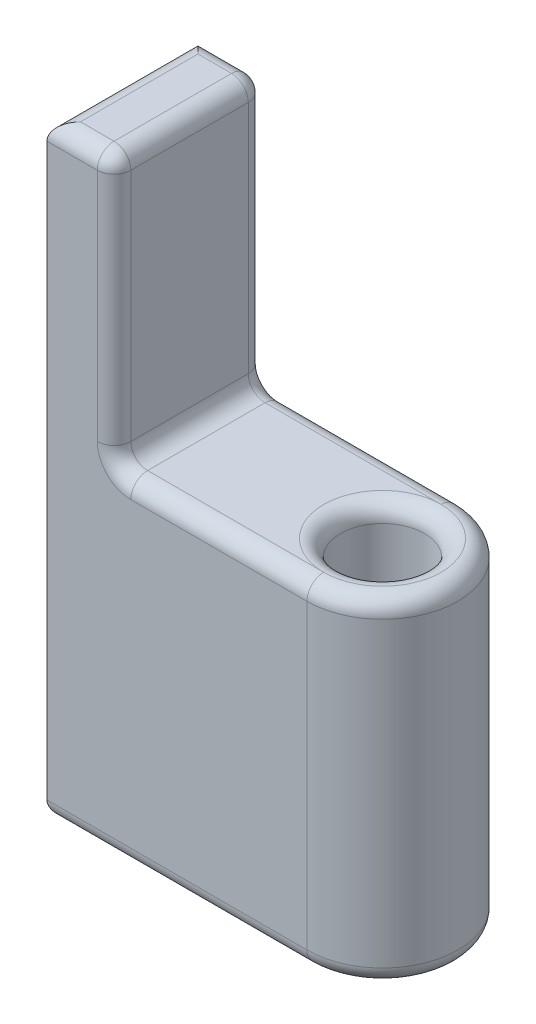
ISO-10303-21;
HEADER;
FILE_DESCRIPTION(('STEP AP214'),'2;1');
FILE_NAME('part.step','',(''),(''),'','','');
FILE_SCHEMA(('AUTOMOTIVE_DESIGN { 1 0 10303 214 1 1 1 1 }'));
ENDSEC;
DATA;
#1=APPLICATION_CONTEXT('core data for automotive mechanical design processes');
#2=APPLICATION_PROTOCOL_DEFINITION('international standard','automotive_design',2000,#1);
#3=PRODUCT_CONTEXT('',#1,'mechanical');
#4=PRODUCT('Part','Part','',(#3));
#5=PRODUCT_RELATED_PRODUCT_CATEGORY('part','',(#4));
#6=PRODUCT_DEFINITION_FORMATION('','',#4);
#7=PRODUCT_DEFINITION_CONTEXT('part definition',#1,'design');
#8=PRODUCT_DEFINITION('design','',#6,#7);
#9=PRODUCT_DEFINITION_SHAPE('','',#8);
#10=(LENGTH_UNIT() NAMED_UNIT(*) SI_UNIT(.MILLI.,.METRE.));
#11=(NAMED_UNIT(*) PLANE_ANGLE_UNIT() SI_UNIT($,.RADIAN.));
#12=(NAMED_UNIT(*) SI_UNIT($,.STERADIAN.) SOLID_ANGLE_UNIT());
#13=UNCERTAINTY_MEASURE_WITH_UNIT(LENGTH_MEASURE(1.E-05),#10,'distance_accuracy_value','');
#14=(GEOMETRIC_REPRESENTATION_CONTEXT(3) GLOBAL_UNCERTAINTY_ASSIGNED_CONTEXT((#13)) GLOBAL_UNIT_ASSIGNED_CONTEXT((#10,
#11,#12)) REPRESENTATION_CONTEXT('',''));
#15=CARTESIAN_POINT('',(0.,0.,0.));
#16=DIRECTION('',(0.,0.,1.));
#17=DIRECTION('',(1.,0.,0.));
#18=AXIS2_PLACEMENT_3D('',#15,#16,#17);
#19=CARTESIAN_POINT('',(15.5,20.,-4.5));
#20=DIRECTION('',(0.,1.,0.));
#21=DIRECTION('',(0.,0.,1.));
#22=AXIS2_PLACEMENT_3D('',#19,#20,#21);
#23=PLANE('',#22);
#24=DIRECTION('',(1.,0.,0.));
#25=VECTOR('',#24,1.);
#26=CARTESIAN_POINT('',(15.5,20.,-1.));
#27=LINE('',#26,#25);
#28=CARTESIAN_POINT('',(5.,20.,-1.));
#29=VERTEX_POINT('',#28);
#30=CARTESIAN_POINT('',(15.5,20.,-1.));
#31=VERTEX_POINT('',#30);
#32=EDGE_CURVE('E62',#29,#31,#27,.T.);
#33=ORIENTED_EDGE('',*,*,#32,.T.);
#34=CARTESIAN_POINT('',(15.5,20.,-4.5));
#35=DIRECTION('',(0.,1.,0.));
#36=DIRECTION('',(0.,0.,1.));
#37=AXIS2_PLACEMENT_3D('',#34,#35,#36);
#38=CIRCLE('',#37,3.5);
#39=CARTESIAN_POINT('',(15.5,20.,-8.));
#40=VERTEX_POINT('',#39);
#41=EDGE_CURVE('E11',#31,#40,#38,.F.);
#42=ORIENTED_EDGE('',*,*,#41,.T.);
#43=DIRECTION('',(-1.,0.,0.));
#44=VECTOR('',#43,1.);
#45=CARTESIAN_POINT('',(4.,20.,-8.));
#46=LINE('',#45,#44);
#47=CARTESIAN_POINT('',(5.,20.,-8.));
#48=VERTEX_POINT('',#47);
#49=EDGE_CURVE('E48',#40,#48,#46,.T.);
#50=ORIENTED_EDGE('',*,*,#49,.T.);
#51=DIRECTION('',(0.,0.,-1.));
#52=VECTOR('',#51,1.);
#53=CARTESIAN_POINT('',(5.,20.,-4.5));
#54=LINE('',#53,#52);
#55=EDGE_CURVE('E271',#48,#29,#54,.F.);
#56=ORIENTED_EDGE('',*,*,#55,.T.);
#57=EDGE_LOOP('',(#33,#42,#50,#56));
#58=FACE_BOUND('',#57,.T.);
#59=ADVANCED_FACE('F38',(#58),#23,.T.);
#60=CARTESIAN_POINT('',(15.5,0.,-4.5));
#61=DIRECTION('',(0.,1.,0.));
#62=DIRECTION('',(0.,0.,1.));
#63=AXIS2_PLACEMENT_3D('',#60,#61,#62);
#64=PLANE('',#63);
#65=DIRECTION('',(-1.,0.,0.));
#66=VECTOR('',#65,1.);
#67=CARTESIAN_POINT('',(15.5,0.,-8.));
#68=LINE('',#67,#66);
#69=CARTESIAN_POINT('',(1.,0.,-8.));
#70=VERTEX_POINT('',#69);
#71=CARTESIAN_POINT('',(15.5,0.,-8.));
#72=VERTEX_POINT('',#71);
#73=EDGE_CURVE('E235',#70,#72,#68,.F.);
#74=ORIENTED_EDGE('',*,*,#73,.T.);
#75=CARTESIAN_POINT('',(15.5,0.,-4.5));
#76=DIRECTION('',(0.,1.,0.));
#77=DIRECTION('',(0.,0.,1.));
#78=AXIS2_PLACEMENT_3D('',#75,#76,#77);
#79=CIRCLE('',#78,3.5);
#80=CARTESIAN_POINT('',(15.5,0.,-1.));
#81=VERTEX_POINT('',#80);
#82=EDGE_CURVE('E241',#72,#81,#79,.T.);
#83=ORIENTED_EDGE('',*,*,#82,.T.);
#84=DIRECTION('',(1.,0.,0.));
#85=VECTOR('',#84,1.);
#86=CARTESIAN_POINT('',(15.5,0.,-1.));
#87=LINE('',#86,#85);
#88=CARTESIAN_POINT('',(1.,0.,-1.));
#89=VERTEX_POINT('',#88);
#90=EDGE_CURVE('E238',#81,#89,#87,.F.);
#91=ORIENTED_EDGE('',*,*,#90,.T.);
#92=DIRECTION('',(0.,0.,1.));
#93=VECTOR('',#92,1.);
#94=CARTESIAN_POINT('',(0.999999999999999,0.,-4.5));
#95=LINE('',#94,#93);
#96=EDGE_CURVE('E232',#89,#70,#95,.F.);
#97=ORIENTED_EDGE('',*,*,#96,.T.);
#98=EDGE_LOOP('',(#74,#83,#91,#97));
#99=FACE_BOUND('',#98,.T.);
#100=ADVANCED_FACE('F360',(#99),#64,.F.);
#101=CARTESIAN_POINT('',(0.,20.,0.));
#102=DIRECTION('',(1.,0.,0.));
#103=DIRECTION('',(0.,0.,-1.));
#104=AXIS2_PLACEMENT_3D('',#101,#102,#103);
#105=PLANE('',#104);
#106=DIRECTION('',(0.,-1.,0.));
#107=VECTOR('',#106,1.);
#108=CARTESIAN_POINT('',(0.,20.,-9.));
#109=LINE('',#108,#107);
#110=CARTESIAN_POINT('',(0.,35.,-9.));
#111=VERTEX_POINT('',#110);
#112=CARTESIAN_POINT('',(0.,1.,-9.));
#113=VERTEX_POINT('',#112);
#114=EDGE_CURVE('E152',#111,#113,#109,.T.);
#115=ORIENTED_EDGE('',*,*,#114,.T.);
#116=DIRECTION('',(0.,0.,1.));
#117=VECTOR('',#116,1.);
#118=CARTESIAN_POINT('',(0.,1.,0.));
#119=LINE('',#118,#117);
#120=CARTESIAN_POINT('',(0.,1.,0.));
#121=VERTEX_POINT('',#120);
#122=EDGE_CURVE('E161',#113,#121,#119,.T.);
#123=ORIENTED_EDGE('',*,*,#122,.T.);
#124=DIRECTION('',(0.,-1.,0.));
#125=VECTOR('',#124,1.);
#126=CARTESIAN_POINT('',(0.,20.,0.));
#127=LINE('',#126,#125);
#128=CARTESIAN_POINT('',(0.,35.,0.));
#129=VERTEX_POINT('',#128);
#130=EDGE_CURVE('E155',#129,#121,#127,.T.);
#131=ORIENTED_EDGE('',*,*,#130,.F.);
#132=DIRECTION('',(0.,0.,1.));
#133=VECTOR('',#132,1.);
#134=CARTESIAN_POINT('',(0.,35.,-9.));
#135=LINE('',#134,#133);
#136=EDGE_CURVE('E149',#129,#111,#135,.F.);
#137=ORIENTED_EDGE('',*,*,#136,.T.);
#138=EDGE_LOOP('',(#115,#123,#131,#137));
#139=FACE_BOUND('',#138,.T.);
#140=ADVANCED_FACE('F151',(#139),#105,.F.);
#141=CARTESIAN_POINT('',(0.,20.,0.));
#142=DIRECTION('',(0.,0.,-1.));
#143=DIRECTION('',(-1.,0.,0.));
#144=AXIS2_PLACEMENT_3D('',#141,#142,#143);
#145=PLANE('',#144);
#146=ORIENTED_EDGE('',*,*,#130,.T.);
#147=DIRECTION('',(1.,0.,0.));
#148=VECTOR('',#147,1.);
#149=CARTESIAN_POINT('',(0.,1.,0.));
#150=LINE('',#149,#148);
#151=CARTESIAN_POINT('',(15.5,1.,0.));
#152=VERTEX_POINT('',#151);
#153=EDGE_CURVE('E228',#121,#152,#150,.T.);
#154=ORIENTED_EDGE('',*,*,#153,.T.);
#155=DIRECTION('',(0.,-1.,0.));
#156=VECTOR('',#155,1.);
#157=CARTESIAN_POINT('',(15.5,20.,0.));
#158=LINE('',#157,#156);
#159=CARTESIAN_POINT('',(15.5,19.,0.));
#160=VERTEX_POINT('',#159);
#161=EDGE_CURVE('E372',#160,#152,#158,.T.);
#162=ORIENTED_EDGE('',*,*,#161,.F.);
#163=DIRECTION('',(1.,0.,0.));
#164=VECTOR('',#163,1.);
#165=CARTESIAN_POINT('',(4.,19.,0.));
#166=LINE('',#165,#164);
#167=CARTESIAN_POINT('',(5.,19.,0.));
#168=VERTEX_POINT('',#167);
#169=EDGE_CURVE('E219',#160,#168,#166,.F.);
#170=ORIENTED_EDGE('',*,*,#169,.T.);
#171=CARTESIAN_POINT('',(5.,21.,0.));
#172=DIRECTION('',(0.,0.,-1.));
#173=DIRECTION('',(-1.,0.,0.));
#174=AXIS2_PLACEMENT_3D('',#171,#172,#173);
#175=CIRCLE('',#174,2.);
#176=CARTESIAN_POINT('',(3.,21.,0.));
#177=VERTEX_POINT('',#176);
#178=EDGE_CURVE('E215',#177,#168,#175,.F.);
#179=ORIENTED_EDGE('',*,*,#178,.F.);
#180=DIRECTION('',(0.,-1.,0.));
#181=VECTOR('',#180,1.);
#182=CARTESIAN_POINT('',(3.,20.,0.));
#183=LINE('',#182,#181);
#184=CARTESIAN_POINT('',(3.,35.,0.));
#185=VERTEX_POINT('',#184);
#186=EDGE_CURVE('E222',#177,#185,#183,.F.);
#187=ORIENTED_EDGE('',*,*,#186,.T.);
#188=DIRECTION('',(1.,0.,0.));
#189=VECTOR('',#188,1.);
#190=CARTESIAN_POINT('',(0.,35.,0.));
#191=LINE('',#190,#189);
#192=EDGE_CURVE('E225',#185,#129,#191,.F.);
#193=ORIENTED_EDGE('',*,*,#192,.T.);
#194=EDGE_LOOP('',(#146,#154,#162,#170,#179,#187,#193));
#195=FACE_BOUND('',#194,.T.);
#196=ADVANCED_FACE('F371',(#195),#145,.F.);
#197=CARTESIAN_POINT('',(15.5,20.,-4.5));
#198=DIRECTION('',(0.,-1.,0.));
#199=DIRECTION('',(0.,0.,-1.));
#200=AXIS2_PLACEMENT_3D('',#197,#198,#199);
#201=CYLINDRICAL_SURFACE('',#200,4.5);
#202=ORIENTED_EDGE('',*,*,#161,.T.);
#203=CARTESIAN_POINT('',(15.5,1.,-4.5));
#204=DIRECTION('',(0.,1.,0.));
#205=DIRECTION('',(0.,0.,1.));
#206=AXIS2_PLACEMENT_3D('',#203,#204,#205);
#207=CIRCLE('',#206,4.5);
#208=CARTESIAN_POINT('',(15.5,1.,-9.));
#209=VERTEX_POINT('',#208);
#210=EDGE_CURVE('E162',#152,#209,#207,.T.);
#211=ORIENTED_EDGE('',*,*,#210,.T.);
#212=DIRECTION('',(0.,-1.,0.));
#213=VECTOR('',#212,1.);
#214=CARTESIAN_POINT('',(15.5,20.,-9.));
#215=LINE('',#214,#213);
#216=CARTESIAN_POINT('',(15.5,19.,-9.));
#217=VERTEX_POINT('',#216);
#218=EDGE_CURVE('E174',#217,#209,#215,.T.);
#219=ORIENTED_EDGE('',*,*,#218,.F.);
#220=CARTESIAN_POINT('',(15.5,19.,-4.5));
#221=DIRECTION('',(0.,1.,0.));
#222=DIRECTION('',(0.,0.,1.));
#223=AXIS2_PLACEMENT_3D('',#220,#221,#222);
#224=CIRCLE('',#223,4.5);
#225=EDGE_CURVE('E253',#217,#160,#224,.F.);
#226=ORIENTED_EDGE('',*,*,#225,.T.);
#227=EDGE_LOOP('',(#202,#211,#219,#226));
#228=FACE_BOUND('',#227,.T.);
#229=ADVANCED_FACE('F375',(#228),#201,.T.);
#230=CARTESIAN_POINT('',(0.,20.,-9.));
#231=DIRECTION('',(0.,0.,1.));
#232=DIRECTION('',(1.,0.,0.));
#233=AXIS2_PLACEMENT_3D('',#230,#231,#232);
#234=PLANE('',#233);
#235=ORIENTED_EDGE('',*,*,#218,.T.);
#236=DIRECTION('',(-1.,0.,0.));
#237=VECTOR('',#236,1.);
#238=CARTESIAN_POINT('',(0.,1.,-9.));
#239=LINE('',#238,#237);
#240=EDGE_CURVE('E172',#209,#113,#239,.T.);
#241=ORIENTED_EDGE('',*,*,#240,.T.);
#242=ORIENTED_EDGE('',*,*,#114,.F.);
#243=DIRECTION('',(-1.,0.,0.));
#244=VECTOR('',#243,1.);
#245=CARTESIAN_POINT('',(4.,35.,-9.));
#246=LINE('',#245,#244);
#247=CARTESIAN_POINT('',(3.,35.,-9.));
#248=VERTEX_POINT('',#247);
#249=EDGE_CURVE('E169',#111,#248,#246,.F.);
#250=ORIENTED_EDGE('',*,*,#249,.T.);
#251=DIRECTION('',(0.,-1.,0.));
#252=VECTOR('',#251,1.);
#253=CARTESIAN_POINT('',(3.,20.,-9.));
#254=LINE('',#253,#252);
#255=CARTESIAN_POINT('',(3.,21.,-9.));
#256=VERTEX_POINT('',#255);
#257=EDGE_CURVE('E193',#248,#256,#254,.T.);
#258=ORIENTED_EDGE('',*,*,#257,.T.);
#259=CARTESIAN_POINT('',(5.,21.,-9.));
#260=DIRECTION('',(0.,0.,1.));
#261=DIRECTION('',(1.,0.,0.));
#262=AXIS2_PLACEMENT_3D('',#259,#260,#261);
#263=CIRCLE('',#262,2.);
#264=CARTESIAN_POINT('',(5.,19.,-9.));
#265=VERTEX_POINT('',#264);
#266=EDGE_CURVE('E199',#265,#256,#263,.F.);
#267=ORIENTED_EDGE('',*,*,#266,.F.);
#268=DIRECTION('',(-1.,0.,0.));
#269=VECTOR('',#268,1.);
#270=CARTESIAN_POINT('',(15.5,19.,-9.));
#271=LINE('',#270,#269);
#272=EDGE_CURVE('E382',#265,#217,#271,.F.);
#273=ORIENTED_EDGE('',*,*,#272,.T.);
#274=EDGE_LOOP('',(#235,#241,#242,#250,#258,#267,#273));
#275=FACE_BOUND('',#274,.T.);
#276=ADVANCED_FACE('F166',(#275),#234,.F.);
#277=CARTESIAN_POINT('',(15.5,20.,-4.5));
#278=DIRECTION('',(0.,-1.,0.));
#279=DIRECTION('',(0.,0.,-1.));
#280=AXIS2_PLACEMENT_3D('',#277,#278,#279);
#281=CYLINDRICAL_SURFACE('',#280,2.5);
#282=CARTESIAN_POINT('',(15.5,1.,-4.5));
#283=DIRECTION('',(0.,1.,0.));
#284=DIRECTION('',(0.,0.,1.));
#285=AXIS2_PLACEMENT_3D('',#282,#283,#284);
#286=CIRCLE('',#285,2.5);
#287=CARTESIAN_POINT('',(15.5,1.,-2.));
#288=VERTEX_POINT('',#287);
#289=EDGE_CURVE('E249',#288,#288,#286,.F.);
#290=ORIENTED_EDGE('',*,*,#289,.T.);
#291=EDGE_LOOP('',(#290));
#292=FACE_BOUND('',#291,.T.);
#293=CARTESIAN_POINT('',(15.5,19.,-4.5));
#294=DIRECTION('',(0.,1.,0.));
#295=DIRECTION('',(0.,0.,1.));
#296=AXIS2_PLACEMENT_3D('',#293,#294,#295);
#297=CIRCLE('',#296,2.5);
#298=CARTESIAN_POINT('',(15.5,19.,-2.));
#299=VERTEX_POINT('',#298);
#300=EDGE_CURVE('E245',#299,#299,#297,.T.);
#301=ORIENTED_EDGE('',*,*,#300,.T.);
#302=EDGE_LOOP('',(#301));
#303=FACE_BOUND('',#302,.T.);
#304=ADVANCED_FACE('F440',(#292,#303),#281,.F.);
#305=CARTESIAN_POINT('',(4.,36.,-9.));
#306=DIRECTION('',(-1.,0.,0.));
#307=DIRECTION('',(0.,0.,1.));
#308=AXIS2_PLACEMENT_3D('',#305,#306,#307);
#309=PLANE('',#308);
#310=DIRECTION('',(0.,-1.,0.));
#311=VECTOR('',#310,1.);
#312=CARTESIAN_POINT('',(4.,36.,-8.));
#313=LINE('',#312,#311);
#314=CARTESIAN_POINT('',(4.,21.,-8.));
#315=VERTEX_POINT('',#314);
#316=CARTESIAN_POINT('',(4.,35.,-8.));
#317=VERTEX_POINT('',#316);
#318=EDGE_CURVE('E208',#315,#317,#313,.F.);
#319=ORIENTED_EDGE('',*,*,#318,.T.);
#320=DIRECTION('',(0.,0.,-1.));
#321=VECTOR('',#320,1.);
#322=CARTESIAN_POINT('',(4.,35.,0.));
#323=LINE('',#322,#321);
#324=CARTESIAN_POINT('',(4.,35.,-1.));
#325=VERTEX_POINT('',#324);
#326=EDGE_CURVE('E212',#317,#325,#323,.F.);
#327=ORIENTED_EDGE('',*,*,#326,.T.);
#328=DIRECTION('',(0.,-1.,0.));
#329=VECTOR('',#328,1.);
#330=CARTESIAN_POINT('',(4.,36.,-1.));
#331=LINE('',#330,#329);
#332=CARTESIAN_POINT('',(4.,21.,-1.));
#333=VERTEX_POINT('',#332);
#334=EDGE_CURVE('E205',#325,#333,#331,.T.);
#335=ORIENTED_EDGE('',*,*,#334,.T.);
#336=DIRECTION('',(0.,0.,-1.));
#337=VECTOR('',#336,1.);
#338=CARTESIAN_POINT('',(4.,21.,-9.));
#339=LINE('',#338,#337);
#340=EDGE_CURVE('E197',#333,#315,#339,.T.);
#341=ORIENTED_EDGE('',*,*,#340,.T.);
#342=EDGE_LOOP('',(#319,#327,#335,#341));
#343=FACE_BOUND('',#342,.T.);
#344=ADVANCED_FACE('F398',(#343),#309,.F.);
#345=CARTESIAN_POINT('',(0.,36.,0.));
#346=DIRECTION('',(0.,1.,0.));
#347=DIRECTION('',(0.,0.,1.));
#348=AXIS2_PLACEMENT_3D('',#345,#346,#347);
#349=PLANE('',#348);
#350=DIRECTION('',(0.,0.,-1.));
#351=VECTOR('',#350,1.);
#352=CARTESIAN_POINT('',(3.,36.,-9.));
#353=LINE('',#352,#351);
#354=CARTESIAN_POINT('',(3.,36.,-1.));
#355=VERTEX_POINT('',#354);
#356=CARTESIAN_POINT('',(3.,36.,-8.));
#357=VERTEX_POINT('',#356);
#358=EDGE_CURVE('E265',#355,#357,#353,.T.);
#359=ORIENTED_EDGE('',*,*,#358,.T.);
#360=DIRECTION('',(-1.,0.,0.));
#361=VECTOR('',#360,1.);
#362=CARTESIAN_POINT('',(0.,36.,-8.));
#363=LINE('',#362,#361);
#364=CARTESIAN_POINT('',(1.,36.,-8.));
#365=VERTEX_POINT('',#364);
#366=EDGE_CURVE('E268',#357,#365,#363,.T.);
#367=ORIENTED_EDGE('',*,*,#366,.T.);
#368=DIRECTION('',(0.,0.,1.));
#369=VECTOR('',#368,1.);
#370=CARTESIAN_POINT('',(1.,36.,0.));
#371=LINE('',#370,#369);
#372=CARTESIAN_POINT('',(1.,36.,-1.));
#373=VERTEX_POINT('',#372);
#374=EDGE_CURVE('E180',#365,#373,#371,.T.);
#375=ORIENTED_EDGE('',*,*,#374,.T.);
#376=DIRECTION('',(1.,0.,0.));
#377=VECTOR('',#376,1.);
#378=CARTESIAN_POINT('',(4.,36.,-1.));
#379=LINE('',#378,#377);
#380=EDGE_CURVE('E262',#373,#355,#379,.T.);
#381=ORIENTED_EDGE('',*,*,#380,.T.);
#382=EDGE_LOOP('',(#359,#367,#375,#381));
#383=FACE_BOUND('',#382,.T.);
#384=ADVANCED_FACE('F601',(#383),#349,.T.);
#385=CARTESIAN_POINT('',(15.5,19.,-4.5));
#386=DIRECTION('',(0.,1.,0.));
#387=DIRECTION('',(0.,0.,1.));
#388=AXIS2_PLACEMENT_3D('',#385,#386,#387);
#389=TOROIDAL_SURFACE('',#388,3.5,1.);
#390=ORIENTED_EDGE('',*,*,#300,.F.);
#391=EDGE_LOOP('',(#390));
#392=FACE_BOUND('',#391,.T.);
#393=CARTESIAN_POINT('',(15.5,20.,-4.5));
#394=DIRECTION('',(0.,1.,0.));
#395=DIRECTION('',(0.,0.,1.));
#396=AXIS2_PLACEMENT_3D('',#393,#394,#395);
#397=CIRCLE('',#396,3.5);
#398=EDGE_CURVE('E315',#40,#31,#397,.F.);
#399=ORIENTED_EDGE('',*,*,#398,.F.);
#400=ORIENTED_EDGE('',*,*,#41,.F.);
#401=EDGE_LOOP('',(#399,#400));
#402=FACE_BOUND('',#401,.T.);
#403=ADVANCED_FACE('F592',(#392,#402),#389,.T.);
#404=CARTESIAN_POINT('',(0.,35.,-1.));
#405=DIRECTION('',(-1.,0.,0.));
#406=DIRECTION('',(0.,0.,1.));
#407=AXIS2_PLACEMENT_3D('',#404,#405,#406);
#408=CYLINDRICAL_SURFACE('',#407,1.);
#409=CARTESIAN_POINT('',(1.,35.,-1.));
#410=DIRECTION('',(-0.707106781186547,0.,-0.707106781186547));
#411=DIRECTION('',(0.707106781186547,0.,-0.707106781186547));
#412=AXIS2_PLACEMENT_3D('',#409,#410,#411);
#413=ELLIPSE('',#412,1.41421356237309,1.);
#414=EDGE_CURVE('E323',#129,#373,#413,.T.);
#415=ORIENTED_EDGE('',*,*,#414,.F.);
#416=ORIENTED_EDGE('',*,*,#192,.F.);
#417=CARTESIAN_POINT('',(3.,35.,-1.));
#418=DIRECTION('',(1.,0.,0.));
#419=DIRECTION('',(0.,0.,-1.));
#420=AXIS2_PLACEMENT_3D('',#417,#418,#419);
#421=CIRCLE('',#420,1.);
#422=EDGE_CURVE('E326',#355,#185,#421,.T.);
#423=ORIENTED_EDGE('',*,*,#422,.F.);
#424=ORIENTED_EDGE('',*,*,#380,.F.);
#425=EDGE_LOOP('',(#415,#416,#423,#424));
#426=FACE_BOUND('',#425,.T.);
#427=ADVANCED_FACE('F584',(#426),#408,.T.);
#428=CARTESIAN_POINT('',(15.5,19.,-1.));
#429=DIRECTION('',(-1.,0.,0.));
#430=DIRECTION('',(0.,0.,1.));
#431=AXIS2_PLACEMENT_3D('',#428,#429,#430);
#432=CYLINDRICAL_SURFACE('',#431,1.);
#433=CARTESIAN_POINT('',(5.,19.,-1.));
#434=DIRECTION('',(-1.,0.,0.));
#435=DIRECTION('',(0.,0.,1.));
#436=AXIS2_PLACEMENT_3D('',#433,#434,#435);
#437=CIRCLE('',#436,1.);
#438=EDGE_CURVE('E311',#168,#29,#437,.T.);
#439=ORIENTED_EDGE('',*,*,#438,.F.);
#440=ORIENTED_EDGE('',*,*,#169,.F.);
#441=CARTESIAN_POINT('',(15.5,19.,-1.));
#442=DIRECTION('',(1.,0.,0.));
#443=DIRECTION('',(0.,0.,-1.));
#444=AXIS2_PLACEMENT_3D('',#441,#442,#443);
#445=CIRCLE('',#444,1.);
#446=EDGE_CURVE('E319',#31,#160,#445,.T.);
#447=ORIENTED_EDGE('',*,*,#446,.F.);
#448=ORIENTED_EDGE('',*,*,#32,.F.);
#449=EDGE_LOOP('',(#439,#440,#447,#448));
#450=FACE_BOUND('',#449,.T.);
#451=ADVANCED_FACE('F415',(#450),#432,.T.);
#452=CARTESIAN_POINT('',(3.,36.,-1.));
#453=DIRECTION('',(0.,-1.,0.));
#454=DIRECTION('',(0.,0.,-1.));
#455=AXIS2_PLACEMENT_3D('',#452,#453,#454);
#456=CYLINDRICAL_SURFACE('',#455,1.);
#457=CARTESIAN_POINT('',(3.,35.,-1.));
#458=DIRECTION('',(0.,1.,0.));
#459=DIRECTION('',(0.,0.,1.));
#460=AXIS2_PLACEMENT_3D('',#457,#458,#459);
#461=CIRCLE('',#460,1.);
#462=EDGE_CURVE('E175',#185,#325,#461,.T.);
#463=ORIENTED_EDGE('',*,*,#462,.F.);
#464=ORIENTED_EDGE('',*,*,#186,.F.);
#465=CARTESIAN_POINT('',(3.,21.,-1.));
#466=DIRECTION('',(0.,-1.,0.));
#467=DIRECTION('',(0.,0.,-1.));
#468=AXIS2_PLACEMENT_3D('',#465,#466,#467);
#469=CIRCLE('',#468,1.);
#470=EDGE_CURVE('E307',#333,#177,#469,.T.);
#471=ORIENTED_EDGE('',*,*,#470,.F.);
#472=ORIENTED_EDGE('',*,*,#334,.F.);
#473=EDGE_LOOP('',(#463,#464,#471,#472));
#474=FACE_BOUND('',#473,.T.);
#475=ADVANCED_FACE('F421',(#474),#456,.T.);
#476=CARTESIAN_POINT('',(3.,35.,-1.));
#477=DIRECTION('',(0.,0.,1.));
#478=DIRECTION('',(1.,0.,0.));
#479=AXIS2_PLACEMENT_3D('',#476,#477,#478);
#480=SPHERICAL_SURFACE('',#479,1.);
#481=ORIENTED_EDGE('',*,*,#422,.T.);
#482=ORIENTED_EDGE('',*,*,#462,.T.);
#483=CARTESIAN_POINT('',(3.,35.,-1.));
#484=DIRECTION('',(0.,0.,1.));
#485=DIRECTION('',(0.,-1.,0.));
#486=AXIS2_PLACEMENT_3D('',#483,#484,#485);
#487=CIRCLE('',#486,1.);
#488=EDGE_CURVE('E185',#355,#325,#487,.F.);
#489=ORIENTED_EDGE('',*,*,#488,.F.);
#490=EDGE_LOOP('',(#481,#482,#489));
#491=FACE_BOUND('',#490,.T.);
#492=ADVANCED_FACE('F561',(#491),#480,.T.);
#493=CARTESIAN_POINT('',(1.,35.,0.));
#494=DIRECTION('',(0.,0.,-1.));
#495=DIRECTION('',(-1.,0.,0.));
#496=AXIS2_PLACEMENT_3D('',#493,#494,#495);
#497=CYLINDRICAL_SURFACE('',#496,1.);
#498=ORIENTED_EDGE('',*,*,#414,.T.);
#499=ORIENTED_EDGE('',*,*,#374,.F.);
#500=CARTESIAN_POINT('',(1.,35.,-8.));
#501=DIRECTION('',(0.707106781186547,0.,-0.707106781186547));
#502=DIRECTION('',(-0.707106781186547,0.,-0.707106781186547));
#503=AXIS2_PLACEMENT_3D('',#500,#501,#502);
#504=ELLIPSE('',#503,1.41421356237309,1.);
#505=EDGE_CURVE('E178',#111,#365,#504,.T.);
#506=ORIENTED_EDGE('',*,*,#505,.F.);
#507=ORIENTED_EDGE('',*,*,#136,.F.);
#508=EDGE_LOOP('',(#498,#499,#506,#507));
#509=FACE_BOUND('',#508,.T.);
#510=ADVANCED_FACE('F179',(#509),#497,.T.);
#511=CARTESIAN_POINT('',(15.5,19.,-4.5));
#512=DIRECTION('',(0.,1.,0.));
#513=DIRECTION('',(0.,0.,1.));
#514=AXIS2_PLACEMENT_3D('',#511,#512,#513);
#515=TOROIDAL_SURFACE('',#514,3.5,1.);
#516=ORIENTED_EDGE('',*,*,#446,.T.);
#517=ORIENTED_EDGE('',*,*,#225,.F.);
#518=CARTESIAN_POINT('',(15.5,19.,-8.));
#519=DIRECTION('',(-1.,0.,0.));
#520=DIRECTION('',(0.,0.,1.));
#521=AXIS2_PLACEMENT_3D('',#518,#519,#520);
#522=CIRCLE('',#521,1.);
#523=EDGE_CURVE('E186',#40,#217,#522,.T.);
#524=ORIENTED_EDGE('',*,*,#523,.F.);
#525=ORIENTED_EDGE('',*,*,#398,.T.);
#526=EDGE_LOOP('',(#516,#517,#524,#525));
#527=FACE_BOUND('',#526,.T.);
#528=ADVANCED_FACE('F410',(#527),#515,.T.);
#529=CARTESIAN_POINT('',(5.,21.,-1.));
#530=DIRECTION('',(0.,0.,-1.));
#531=DIRECTION('',(-1.,0.,0.));
#532=AXIS2_PLACEMENT_3D('',#529,#530,#531);
#533=TOROIDAL_SURFACE('',#532,2.,1.);
#534=ORIENTED_EDGE('',*,*,#178,.T.);
#535=ORIENTED_EDGE('',*,*,#438,.T.);
#536=CARTESIAN_POINT('',(5.,21.,-1.));
#537=DIRECTION('',(0.,0.,-1.));
#538=DIRECTION('',(-1.,0.,0.));
#539=AXIS2_PLACEMENT_3D('',#536,#537,#538);
#540=CIRCLE('',#539,1.);
#541=EDGE_CURVE('E298',#333,#29,#540,.F.);
#542=ORIENTED_EDGE('',*,*,#541,.F.);
#543=ORIENTED_EDGE('',*,*,#470,.T.);
#544=EDGE_LOOP('',(#534,#535,#542,#543));
#545=FACE_BOUND('',#544,.T.);
#546=ADVANCED_FACE('F422',(#545),#533,.T.);
#547=CARTESIAN_POINT('',(3.,35.,0.));
#548=DIRECTION('',(0.,0.,1.));
#549=DIRECTION('',(1.,0.,0.));
#550=AXIS2_PLACEMENT_3D('',#547,#548,#549);
#551=CYLINDRICAL_SURFACE('',#550,1.);
#552=ORIENTED_EDGE('',*,*,#488,.T.);
#553=ORIENTED_EDGE('',*,*,#326,.F.);
#554=CARTESIAN_POINT('',(3.,35.,-8.));
#555=DIRECTION('',(0.,0.,-1.));
#556=DIRECTION('',(-1.,0.,0.));
#557=AXIS2_PLACEMENT_3D('',#554,#555,#556);
#558=CIRCLE('',#557,1.);
#559=EDGE_CURVE('E294',#357,#317,#558,.T.);
#560=ORIENTED_EDGE('',*,*,#559,.F.);
#561=ORIENTED_EDGE('',*,*,#358,.F.);
#562=EDGE_LOOP('',(#552,#553,#560,#561));
#563=FACE_BOUND('',#562,.T.);
#564=ADVANCED_FACE('F424',(#563),#551,.T.);
#565=CARTESIAN_POINT('',(0.,35.,-8.));
#566=DIRECTION('',(1.,0.,0.));
#567=DIRECTION('',(0.,0.,-1.));
#568=AXIS2_PLACEMENT_3D('',#565,#566,#567);
#569=CYLINDRICAL_SURFACE('',#568,1.);
#570=ORIENTED_EDGE('',*,*,#505,.T.);
#571=ORIENTED_EDGE('',*,*,#366,.F.);
#572=CARTESIAN_POINT('',(3.,35.,-8.));
#573=DIRECTION('',(1.,0.,0.));
#574=DIRECTION('',(0.,0.,-1.));
#575=AXIS2_PLACEMENT_3D('',#572,#573,#574);
#576=CIRCLE('',#575,1.);
#577=EDGE_CURVE('E190',#248,#357,#576,.T.);
#578=ORIENTED_EDGE('',*,*,#577,.F.);
#579=ORIENTED_EDGE('',*,*,#249,.F.);
#580=EDGE_LOOP('',(#570,#571,#578,#579));
#581=FACE_BOUND('',#580,.T.);
#582=ADVANCED_FACE('F188',(#581),#569,.T.);
#583=CARTESIAN_POINT('',(15.5,19.,-8.));
#584=DIRECTION('',(1.,0.,0.));
#585=DIRECTION('',(0.,0.,-1.));
#586=AXIS2_PLACEMENT_3D('',#583,#584,#585);
#587=CYLINDRICAL_SURFACE('',#586,1.);
#588=ORIENTED_EDGE('',*,*,#523,.T.);
#589=ORIENTED_EDGE('',*,*,#272,.F.);
#590=CARTESIAN_POINT('',(5.,19.,-8.));
#591=DIRECTION('',(-1.,0.,0.));
#592=DIRECTION('',(0.,0.,1.));
#593=AXIS2_PLACEMENT_3D('',#590,#591,#592);
#594=CIRCLE('',#593,1.);
#595=EDGE_CURVE('E288',#48,#265,#594,.T.);
#596=ORIENTED_EDGE('',*,*,#595,.F.);
#597=ORIENTED_EDGE('',*,*,#49,.F.);
#598=EDGE_LOOP('',(#588,#589,#596,#597));
#599=FACE_BOUND('',#598,.T.);
#600=ADVANCED_FACE('F408',(#599),#587,.T.);
#601=CARTESIAN_POINT('',(5.,21.,-9.));
#602=DIRECTION('',(0.,0.,-1.));
#603=DIRECTION('',(-1.,0.,0.));
#604=AXIS2_PLACEMENT_3D('',#601,#602,#603);
#605=CYLINDRICAL_SURFACE('',#604,1.);
#606=ORIENTED_EDGE('',*,*,#541,.T.);
#607=ORIENTED_EDGE('',*,*,#55,.F.);
#608=CARTESIAN_POINT('',(5.,21.,-8.));
#609=DIRECTION('',(0.,0.,1.));
#610=DIRECTION('',(1.,0.,0.));
#611=AXIS2_PLACEMENT_3D('',#608,#609,#610);
#612=CIRCLE('',#611,1.);
#613=EDGE_CURVE('E284',#315,#48,#612,.T.);
#614=ORIENTED_EDGE('',*,*,#613,.F.);
#615=ORIENTED_EDGE('',*,*,#340,.F.);
#616=EDGE_LOOP('',(#606,#607,#614,#615));
#617=FACE_BOUND('',#616,.T.);
#618=ADVANCED_FACE('F406',(#617),#605,.F.);
#619=CARTESIAN_POINT('',(3.,35.,-8.));
#620=DIRECTION('',(0.,0.,1.));
#621=DIRECTION('',(1.,0.,0.));
#622=AXIS2_PLACEMENT_3D('',#619,#620,#621);
#623=SPHERICAL_SURFACE('',#622,1.);
#624=ORIENTED_EDGE('',*,*,#577,.T.);
#625=ORIENTED_EDGE('',*,*,#559,.T.);
#626=CARTESIAN_POINT('',(3.,35.,-8.));
#627=DIRECTION('',(0.,1.,0.));
#628=DIRECTION('',(0.,0.,1.));
#629=AXIS2_PLACEMENT_3D('',#626,#627,#628);
#630=CIRCLE('',#629,1.);
#631=EDGE_CURVE('E281',#248,#317,#630,.F.);
#632=ORIENTED_EDGE('',*,*,#631,.F.);
#633=EDGE_LOOP('',(#624,#625,#632));
#634=FACE_BOUND('',#633,.T.);
#635=ADVANCED_FACE('F455',(#634),#623,.T.);
#636=CARTESIAN_POINT('',(5.,21.,-8.));
#637=DIRECTION('',(0.,0.,1.));
#638=DIRECTION('',(1.,0.,0.));
#639=AXIS2_PLACEMENT_3D('',#636,#637,#638);
#640=TOROIDAL_SURFACE('',#639,2.,1.);
#641=ORIENTED_EDGE('',*,*,#595,.T.);
#642=ORIENTED_EDGE('',*,*,#266,.T.);
#643=CARTESIAN_POINT('',(3.,21.,-8.));
#644=DIRECTION('',(0.,-1.,0.));
#645=DIRECTION('',(0.,0.,-1.));
#646=AXIS2_PLACEMENT_3D('',#643,#644,#645);
#647=CIRCLE('',#646,1.);
#648=EDGE_CURVE('E278',#315,#256,#647,.F.);
#649=ORIENTED_EDGE('',*,*,#648,.F.);
#650=ORIENTED_EDGE('',*,*,#613,.T.);
#651=EDGE_LOOP('',(#641,#642,#649,#650));
#652=FACE_BOUND('',#651,.T.);
#653=ADVANCED_FACE('F391',(#652),#640,.T.);
#654=CARTESIAN_POINT('',(3.,20.,-8.));
#655=DIRECTION('',(0.,-1.,0.));
#656=DIRECTION('',(0.,0.,-1.));
#657=AXIS2_PLACEMENT_3D('',#654,#655,#656);
#658=CYLINDRICAL_SURFACE('',#657,1.);
#659=ORIENTED_EDGE('',*,*,#631,.T.);
#660=ORIENTED_EDGE('',*,*,#318,.F.);
#661=ORIENTED_EDGE('',*,*,#648,.T.);
#662=ORIENTED_EDGE('',*,*,#257,.F.);
#663=EDGE_LOOP('',(#659,#660,#661,#662));
#664=FACE_BOUND('',#663,.T.);
#665=ADVANCED_FACE('F395',(#664),#658,.T.);
#666=CARTESIAN_POINT('',(1.,1.,0.));
#667=DIRECTION('',(0.,0.,1.));
#668=DIRECTION('',(1.,0.,0.));
#669=AXIS2_PLACEMENT_3D('',#666,#667,#668);
#670=CYLINDRICAL_SURFACE('',#669,1.);
#671=CARTESIAN_POINT('',(1.,1.,-8.));
#672=DIRECTION('',(-0.707106781186547,0.,0.707106781186547));
#673=DIRECTION('',(0.707106781186547,0.,0.707106781186547));
#674=AXIS2_PLACEMENT_3D('',#671,#672,#673);
#675=ELLIPSE('',#674,1.41421356237309,1.);
#676=EDGE_CURVE('E343',#70,#113,#675,.F.);
#677=ORIENTED_EDGE('',*,*,#676,.F.);
#678=ORIENTED_EDGE('',*,*,#96,.F.);
#679=CARTESIAN_POINT('',(1.,1.,-1.));
#680=DIRECTION('',(0.707106781186547,0.,0.707106781186547));
#681=DIRECTION('',(-0.707106781186547,0.,0.707106781186547));
#682=AXIS2_PLACEMENT_3D('',#679,#680,#681);
#683=ELLIPSE('',#682,1.41421356237309,1.);
#684=EDGE_CURVE('E42',#121,#89,#683,.T.);
#685=ORIENTED_EDGE('',*,*,#684,.F.);
#686=ORIENTED_EDGE('',*,*,#122,.F.);
#687=EDGE_LOOP('',(#677,#678,#685,#686));
#688=FACE_BOUND('',#687,.T.);
#689=ADVANCED_FACE('F40',(#688),#670,.T.);
#690=CARTESIAN_POINT('',(0.,1.,-1.));
#691=DIRECTION('',(1.,0.,0.));
#692=DIRECTION('',(0.,0.,-1.));
#693=AXIS2_PLACEMENT_3D('',#690,#691,#692);
#694=CYLINDRICAL_SURFACE('',#693,1.);
#695=ORIENTED_EDGE('',*,*,#684,.T.);
#696=ORIENTED_EDGE('',*,*,#90,.F.);
#697=CARTESIAN_POINT('',(15.5,1.,-1.));
#698=DIRECTION('',(1.,0.,0.));
#699=DIRECTION('',(0.,0.,-1.));
#700=AXIS2_PLACEMENT_3D('',#697,#698,#699);
#701=CIRCLE('',#700,1.);
#702=EDGE_CURVE('E340',#152,#81,#701,.T.);
#703=ORIENTED_EDGE('',*,*,#702,.F.);
#704=ORIENTED_EDGE('',*,*,#153,.F.);
#705=EDGE_LOOP('',(#695,#696,#703,#704));
#706=FACE_BOUND('',#705,.T.);
#707=ADVANCED_FACE('F355',(#706),#694,.T.);
#708=CARTESIAN_POINT('',(0.,1.,-8.));
#709=DIRECTION('',(-1.,0.,0.));
#710=DIRECTION('',(0.,0.,1.));
#711=AXIS2_PLACEMENT_3D('',#708,#709,#710);
#712=CYLINDRICAL_SURFACE('',#711,1.);
#713=ORIENTED_EDGE('',*,*,#676,.T.);
#714=ORIENTED_EDGE('',*,*,#240,.F.);
#715=CARTESIAN_POINT('',(15.5,1.,-8.));
#716=DIRECTION('',(1.,0.,0.));
#717=DIRECTION('',(0.,0.,-1.));
#718=AXIS2_PLACEMENT_3D('',#715,#716,#717);
#719=CIRCLE('',#718,1.);
#720=EDGE_CURVE('E336',#72,#209,#719,.T.);
#721=ORIENTED_EDGE('',*,*,#720,.F.);
#722=ORIENTED_EDGE('',*,*,#73,.F.);
#723=EDGE_LOOP('',(#713,#714,#721,#722));
#724=FACE_BOUND('',#723,.T.);
#725=ADVANCED_FACE('F499',(#724),#712,.T.);
#726=CARTESIAN_POINT('',(15.5,1.,-4.5));
#727=DIRECTION('',(0.,1.,0.));
#728=DIRECTION('',(0.,0.,1.));
#729=AXIS2_PLACEMENT_3D('',#726,#727,#728);
#730=TOROIDAL_SURFACE('',#729,3.5,1.);
#731=CARTESIAN_POINT('',(15.5,0.,-4.5));
#732=DIRECTION('',(0.,1.,0.));
#733=DIRECTION('',(0.,0.,1.));
#734=AXIS2_PLACEMENT_3D('',#731,#732,#733);
#735=CIRCLE('',#734,3.5);
#736=EDGE_CURVE('E333',#72,#81,#735,.F.);
#737=ORIENTED_EDGE('',*,*,#736,.F.);
#738=ORIENTED_EDGE('',*,*,#720,.T.);
#739=ORIENTED_EDGE('',*,*,#210,.F.);
#740=ORIENTED_EDGE('',*,*,#702,.T.);
#741=EDGE_LOOP('',(#737,#738,#739,#740));
#742=FACE_BOUND('',#741,.T.);
#743=ADVANCED_FACE('F367',(#742),#730,.T.);
#744=CARTESIAN_POINT('',(15.5,1.,-4.5));
#745=DIRECTION('',(0.,1.,0.));
#746=DIRECTION('',(0.,0.,1.));
#747=AXIS2_PLACEMENT_3D('',#744,#745,#746);
#748=TOROIDAL_SURFACE('',#747,3.5,1.);
#749=ORIENTED_EDGE('',*,*,#289,.F.);
#750=EDGE_LOOP('',(#749));
#751=FACE_BOUND('',#750,.T.);
#752=ORIENTED_EDGE('',*,*,#82,.F.);
#753=ORIENTED_EDGE('',*,*,#736,.T.);
#754=EDGE_LOOP('',(#752,#753));
#755=FACE_BOUND('',#754,.T.);
#756=ADVANCED_FACE('F364',(#751,#755),#748,.T.);
#757=CLOSED_SHELL('',(#59,#100,#140,#196,#229,#276,#304,#344,#384,#403,#427,#451,#475,#492,#510,
#528,#546,#564,#582,#600,#618,#635,#653,#665,#689,#707,#725,#743,#756));
#758=MANIFOLD_SOLID_BREP('B2',#757);
#759=ADVANCED_BREP_SHAPE_REPRESENTATION('',(#18,#758),#14);
#760=SHAPE_DEFINITION_REPRESENTATION(#9,#759);
ENDSEC;
END-ISO-10303-21;
